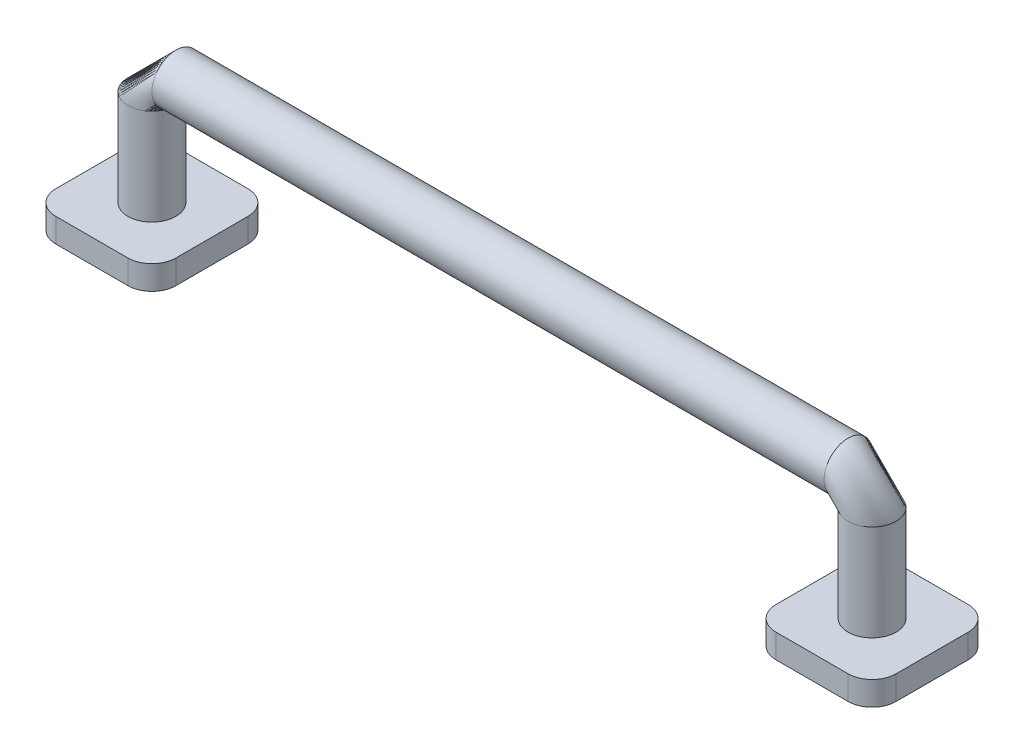
ISO-10303-21;
HEADER;
FILE_DESCRIPTION(('STEP AP214'),'2;1');
FILE_NAME('part.step','',(''),(''),'','','');
FILE_SCHEMA(('AUTOMOTIVE_DESIGN { 1 0 10303 214 1 1 1 1 }'));
ENDSEC;
DATA;
#1=APPLICATION_CONTEXT('core data for automotive mechanical design processes');
#2=APPLICATION_PROTOCOL_DEFINITION('international standard','automotive_design',2000,#1);
#3=PRODUCT_CONTEXT('',#1,'mechanical');
#4=PRODUCT('Part','Part','',(#3));
#5=PRODUCT_RELATED_PRODUCT_CATEGORY('part','',(#4));
#6=PRODUCT_DEFINITION_FORMATION('','',#4);
#7=PRODUCT_DEFINITION_CONTEXT('part definition',#1,'design');
#8=PRODUCT_DEFINITION('design','',#6,#7);
#9=PRODUCT_DEFINITION_SHAPE('','',#8);
#10=(LENGTH_UNIT() NAMED_UNIT(*) SI_UNIT(.MILLI.,.METRE.));
#11=(NAMED_UNIT(*) PLANE_ANGLE_UNIT() SI_UNIT($,.RADIAN.));
#12=(NAMED_UNIT(*) SI_UNIT($,.STERADIAN.) SOLID_ANGLE_UNIT());
#13=UNCERTAINTY_MEASURE_WITH_UNIT(LENGTH_MEASURE(1.E-05),#10,'distance_accuracy_value','');
#14=(GEOMETRIC_REPRESENTATION_CONTEXT(3) GLOBAL_UNCERTAINTY_ASSIGNED_CONTEXT((#13)) GLOBAL_UNIT_ASSIGNED_CONTEXT((#10,
#11,#12)) REPRESENTATION_CONTEXT('',''));
#15=CARTESIAN_POINT('',(0.,0.,0.));
#16=DIRECTION('',(0.,0.,1.));
#17=DIRECTION('',(1.,0.,0.));
#18=AXIS2_PLACEMENT_3D('',#15,#16,#17);
#19=CARTESIAN_POINT('',(1535.3371242892,0.,0.));
#20=DIRECTION('',(0.,1.,0.));
#21=DIRECTION('',(0.,0.,1.));
#22=AXIS2_PLACEMENT_3D('',#19,#20,#21);
#23=CYLINDRICAL_SURFACE('',#22,99.9999999999999);
#24=CARTESIAN_POINT('',(1535.3371242892,400.,0.));
#25=DIRECTION('',(0.,-1.,0.));
#26=DIRECTION('',(1.,0.,0.));
#27=AXIS2_PLACEMENT_3D('',#24,#25,#26);
#28=CIRCLE('',#27,99.9999999999999);
#29=CARTESIAN_POINT('',(1435.3371242892,400.,0.));
#30=VERTEX_POINT('',#29);
#31=EDGE_CURVE('E66',#30,#30,#28,.T.);
#32=ORIENTED_EDGE('',*,*,#31,.T.);
#33=EDGE_LOOP('',(#32));
#34=FACE_BOUND('',#33,.T.);
#35=CARTESIAN_POINT('',(1535.3371242892,0.,0.));
#36=DIRECTION('',(0.,-1.,0.));
#37=DIRECTION('',(1.,0.,0.));
#38=AXIS2_PLACEMENT_3D('',#35,#36,#37);
#39=CIRCLE('',#38,99.9999999999999);
#40=CARTESIAN_POINT('',(1635.3371242892,-1.75298372309235E-13,0.));
#41=VERTEX_POINT('',#40);
#42=EDGE_CURVE('E274',#41,#41,#39,.T.);
#43=ORIENTED_EDGE('',*,*,#42,.F.);
#44=EDGE_LOOP('',(#43));
#45=FACE_BOUND('',#44,.T.);
#46=ADVANCED_FACE('F51',(#34,#45),#23,.T.);
#47=CARTESIAN_POINT('',(1435.3371242892,400.,0.));
#48=DIRECTION('',(0.,0.,1.));
#49=DIRECTION('',(1.,0.,0.));
#50=AXIS2_PLACEMENT_3D('',#47,#48,#49);
#51=TOROIDAL_SURFACE('',#50,100.,99.9999999999999);
#52=CARTESIAN_POINT('',(1435.33712428919,500.,0.));
#53=DIRECTION('',(1.,0.,0.));
#54=DIRECTION('',(0.,1.,0.));
#55=AXIS2_PLACEMENT_3D('',#52,#53,#54);
#56=CIRCLE('',#55,99.9999999999999);
#57=EDGE_CURVE('E278',#30,#30,#56,.T.);
#58=ORIENTED_EDGE('',*,*,#57,.T.);
#59=ORIENTED_EDGE('',*,*,#31,.F.);
#60=EDGE_LOOP('',(#58,#59));
#61=FACE_BOUND('',#60,.T.);
#62=ADVANCED_FACE('F346',(#61),#51,.T.);
#63=CARTESIAN_POINT('',(1435.33712428919,500.,0.));
#64=DIRECTION('',(-1.,0.,0.));
#65=DIRECTION('',(0.,-1.,0.));
#66=AXIS2_PLACEMENT_3D('',#63,#64,#65);
#67=CYLINDRICAL_SURFACE('',#66,99.9999999999999);
#68=CARTESIAN_POINT('',(-1364.6628757108,500.,0.));
#69=DIRECTION('',(1.,0.,0.));
#70=DIRECTION('',(0.,1.,0.));
#71=AXIS2_PLACEMENT_3D('',#68,#69,#70);
#72=CIRCLE('',#71,99.9999999999999);
#73=CARTESIAN_POINT('',(-1364.6628757108,400.,0.));
#74=VERTEX_POINT('',#73);
#75=EDGE_CURVE('E60',#74,#74,#72,.T.);
#76=ORIENTED_EDGE('',*,*,#75,.T.);
#77=EDGE_LOOP('',(#76));
#78=FACE_BOUND('',#77,.T.);
#79=ORIENTED_EDGE('',*,*,#57,.F.);
#80=EDGE_LOOP('',(#79));
#81=FACE_BOUND('',#80,.T.);
#82=ADVANCED_FACE('F281',(#78,#81),#67,.T.);
#83=CARTESIAN_POINT('',(-1364.6628757108,400.,0.));
#84=DIRECTION('',(0.,0.,1.));
#85=DIRECTION('',(1.,0.,0.));
#86=AXIS2_PLACEMENT_3D('',#83,#84,#85);
#87=TOROIDAL_SURFACE('',#86,100.,99.9999999999999);
#88=CARTESIAN_POINT('',(-1464.6628757108,400.00000000001,0.));
#89=DIRECTION('',(0.,1.,0.));
#90=DIRECTION('',(-1.,0.,0.));
#91=AXIS2_PLACEMENT_3D('',#88,#89,#90);
#92=CIRCLE('',#91,99.9999999999999);
#93=EDGE_CURVE('E12',#74,#74,#92,.T.);
#94=ORIENTED_EDGE('',*,*,#93,.T.);
#95=ORIENTED_EDGE('',*,*,#75,.F.);
#96=EDGE_LOOP('',(#94,#95));
#97=FACE_BOUND('',#96,.T.);
#98=ADVANCED_FACE('F284',(#97),#87,.T.);
#99=CARTESIAN_POINT('',(-1464.6628757108,399.999999999999,0.));
#100=DIRECTION('',(0.,-1.,0.));
#101=DIRECTION('',(0.,0.,-1.));
#102=AXIS2_PLACEMENT_3D('',#99,#100,#101);
#103=CYLINDRICAL_SURFACE('',#102,99.9999999999999);
#104=CARTESIAN_POINT('',(-1464.6628757108,0.,0.));
#105=DIRECTION('',(0.,1.,0.));
#106=DIRECTION('',(-1.,0.,0.));
#107=AXIS2_PLACEMENT_3D('',#104,#105,#106);
#108=CIRCLE('',#107,99.9999999999999);
#109=CARTESIAN_POINT('',(-1564.6628757108,1.19787221077977E-13,0.));
#110=VERTEX_POINT('',#109);
#111=EDGE_CURVE('E55',#110,#110,#108,.T.);
#112=ORIENTED_EDGE('',*,*,#111,.T.);
#113=EDGE_LOOP('',(#112));
#114=FACE_BOUND('',#113,.T.);
#115=ORIENTED_EDGE('',*,*,#93,.F.);
#116=EDGE_LOOP('',(#115));
#117=FACE_BOUND('',#116,.T.);
#118=ADVANCED_FACE('F53',(#114,#117),#103,.T.);
#119=CARTESIAN_POINT('',(1685.3371242892,-100.000000000003,-150.));
#120=DIRECTION('',(0.,1.,0.));
#121=DIRECTION('',(-1.,0.,0.));
#122=AXIS2_PLACEMENT_3D('',#119,#120,#121);
#123=CYLINDRICAL_SURFACE('',#122,100.);
#124=CARTESIAN_POINT('',(1685.3371242892,-2.95436854680224E-12,-150.));
#125=DIRECTION('',(0.,-1.,0.));
#126=DIRECTION('',(-1.,0.,0.));
#127=AXIS2_PLACEMENT_3D('',#124,#125,#126);
#128=CIRCLE('',#127,100.);
#129=CARTESIAN_POINT('',(1685.33712428919,-2.95436854680224E-12,-250.));
#130=VERTEX_POINT('',#129);
#131=CARTESIAN_POINT('',(1785.3371242892,-3.12966691911147E-12,-149.999999999999));
#132=VERTEX_POINT('',#131);
#133=EDGE_CURVE('E198',#130,#132,#128,.T.);
#134=ORIENTED_EDGE('',*,*,#133,.T.);
#135=DIRECTION('',(0.,1.,0.));
#136=VECTOR('',#135,1.);
#137=CARTESIAN_POINT('',(1785.3371242892,-100.000000000003,-149.999999999999));
#138=LINE('',#137,#136);
#139=CARTESIAN_POINT('',(1785.3371242892,-100.000000000003,-149.999999999999));
#140=VERTEX_POINT('',#139);
#141=EDGE_CURVE('E271',#140,#132,#138,.T.);
#142=ORIENTED_EDGE('',*,*,#141,.F.);
#143=CARTESIAN_POINT('',(1685.3371242892,-100.000000000003,-150.));
#144=DIRECTION('',(0.,-1.,0.));
#145=DIRECTION('',(-1.,0.,0.));
#146=AXIS2_PLACEMENT_3D('',#143,#144,#145);
#147=CIRCLE('',#146,100.);
#148=CARTESIAN_POINT('',(1685.33712428919,-100.000000000003,-250.));
#149=VERTEX_POINT('',#148);
#150=EDGE_CURVE('E217',#149,#140,#147,.T.);
#151=ORIENTED_EDGE('',*,*,#150,.F.);
#152=DIRECTION('',(0.,1.,0.));
#153=VECTOR('',#152,1.);
#154=CARTESIAN_POINT('',(1685.33712428919,-100.000000000003,-250.));
#155=LINE('',#154,#153);
#156=EDGE_CURVE('E235',#149,#130,#155,.T.);
#157=ORIENTED_EDGE('',*,*,#156,.T.);
#158=EDGE_LOOP('',(#134,#142,#151,#157));
#159=FACE_BOUND('',#158,.T.);
#160=ADVANCED_FACE('F287',(#159),#123,.T.);
#161=CARTESIAN_POINT('',(1785.3371242892,-100.000000000003,149.999999999999));
#162=DIRECTION('',(-1.,0.,0.));
#163=DIRECTION('',(0.,-1.,0.));
#164=AXIS2_PLACEMENT_3D('',#161,#162,#163);
#165=PLANE('',#164);
#166=DIRECTION('',(0.,0.,1.));
#167=VECTOR('',#166,1.);
#168=CARTESIAN_POINT('',(1785.3371242892,-3.12966691911147E-12,149.999999999999));
#169=LINE('',#168,#167);
#170=CARTESIAN_POINT('',(1785.3371242892,-3.12966691911147E-12,149.999999999999));
#171=VERTEX_POINT('',#170);
#172=EDGE_CURVE('E238',#132,#171,#169,.T.);
#173=ORIENTED_EDGE('',*,*,#172,.T.);
#174=DIRECTION('',(0.,1.,0.));
#175=VECTOR('',#174,1.);
#176=CARTESIAN_POINT('',(1785.3371242892,-100.000000000003,149.999999999999));
#177=LINE('',#176,#175);
#178=CARTESIAN_POINT('',(1785.3371242892,-100.000000000003,149.999999999999));
#179=VERTEX_POINT('',#178);
#180=EDGE_CURVE('E268',#179,#171,#177,.T.);
#181=ORIENTED_EDGE('',*,*,#180,.F.);
#182=DIRECTION('',(0.,0.,1.));
#183=VECTOR('',#182,1.);
#184=CARTESIAN_POINT('',(1785.3371242892,-100.000000000003,149.999999999999));
#185=LINE('',#184,#183);
#186=EDGE_CURVE('E220',#140,#179,#185,.T.);
#187=ORIENTED_EDGE('',*,*,#186,.F.);
#188=ORIENTED_EDGE('',*,*,#141,.T.);
#189=EDGE_LOOP('',(#173,#181,#187,#188));
#190=FACE_BOUND('',#189,.T.);
#191=ADVANCED_FACE('F293',(#190),#165,.F.);
#192=CARTESIAN_POINT('',(1685.3371242892,-100.000000000003,150.));
#193=DIRECTION('',(0.,1.,0.));
#194=DIRECTION('',(-1.,0.,0.));
#195=AXIS2_PLACEMENT_3D('',#192,#193,#194);
#196=CYLINDRICAL_SURFACE('',#195,100.);
#197=CARTESIAN_POINT('',(1685.3371242892,-2.95436854680224E-12,150.));
#198=DIRECTION('',(0.,-1.,0.));
#199=DIRECTION('',(-1.,0.,0.));
#200=AXIS2_PLACEMENT_3D('',#197,#198,#199);
#201=CIRCLE('',#200,100.);
#202=CARTESIAN_POINT('',(1685.33712428919,-2.95436854680224E-12,250.));
#203=VERTEX_POINT('',#202);
#204=EDGE_CURVE('E240',#171,#203,#201,.T.);
#205=ORIENTED_EDGE('',*,*,#204,.T.);
#206=DIRECTION('',(0.,1.,0.));
#207=VECTOR('',#206,1.);
#208=CARTESIAN_POINT('',(1685.33712428919,-100.000000000003,250.));
#209=LINE('',#208,#207);
#210=CARTESIAN_POINT('',(1685.33712428919,-100.000000000003,250.));
#211=VERTEX_POINT('',#210);
#212=EDGE_CURVE('E265',#211,#203,#209,.T.);
#213=ORIENTED_EDGE('',*,*,#212,.F.);
#214=CARTESIAN_POINT('',(1685.3371242892,-100.000000000003,150.));
#215=DIRECTION('',(0.,-1.,0.));
#216=DIRECTION('',(-1.,0.,0.));
#217=AXIS2_PLACEMENT_3D('',#214,#215,#216);
#218=CIRCLE('',#217,100.);
#219=EDGE_CURVE('E223',#179,#211,#218,.T.);
#220=ORIENTED_EDGE('',*,*,#219,.F.);
#221=ORIENTED_EDGE('',*,*,#180,.T.);
#222=EDGE_LOOP('',(#205,#213,#220,#221));
#223=FACE_BOUND('',#222,.T.);
#224=ADVANCED_FACE('F336',(#223),#196,.T.);
#225=CARTESIAN_POINT('',(1385.3371242892,-100.000000000002,250.));
#226=DIRECTION('',(0.,0.,-1.));
#227=DIRECTION('',(-1.,0.,0.));
#228=AXIS2_PLACEMENT_3D('',#225,#226,#227);
#229=PLANE('',#228);
#230=DIRECTION('',(-1.,0.,0.));
#231=VECTOR('',#230,1.);
#232=CARTESIAN_POINT('',(1385.3371242892,-2.42847342987453E-12,250.));
#233=LINE('',#232,#231);
#234=CARTESIAN_POINT('',(1385.3371242892,-2.42847342987453E-12,250.));
#235=VERTEX_POINT('',#234);
#236=EDGE_CURVE('E242',#203,#235,#233,.T.);
#237=ORIENTED_EDGE('',*,*,#236,.T.);
#238=DIRECTION('',(0.,1.,0.));
#239=VECTOR('',#238,1.);
#240=CARTESIAN_POINT('',(1385.3371242892,-100.000000000002,250.));
#241=LINE('',#240,#239);
#242=CARTESIAN_POINT('',(1385.3371242892,-100.000000000002,250.));
#243=VERTEX_POINT('',#242);
#244=EDGE_CURVE('E262',#243,#235,#241,.T.);
#245=ORIENTED_EDGE('',*,*,#244,.F.);
#246=DIRECTION('',(-1.,0.,0.));
#247=VECTOR('',#246,1.);
#248=CARTESIAN_POINT('',(1385.3371242892,-100.000000000002,250.));
#249=LINE('',#248,#247);
#250=EDGE_CURVE('E225',#211,#243,#249,.T.);
#251=ORIENTED_EDGE('',*,*,#250,.F.);
#252=ORIENTED_EDGE('',*,*,#212,.T.);
#253=EDGE_LOOP('',(#237,#245,#251,#252));
#254=FACE_BOUND('',#253,.T.);
#255=ADVANCED_FACE('F332',(#254),#229,.F.);
#256=CARTESIAN_POINT('',(1385.3371242892,-100.000000000002,150.));
#257=DIRECTION('',(0.,1.,0.));
#258=DIRECTION('',(-1.,0.,0.));
#259=AXIS2_PLACEMENT_3D('',#256,#257,#258);
#260=CYLINDRICAL_SURFACE('',#259,100.);
#261=CARTESIAN_POINT('',(1385.3371242892,-2.42847342987453E-12,150.));
#262=DIRECTION('',(0.,-1.,0.));
#263=DIRECTION('',(1.,0.,0.));
#264=AXIS2_PLACEMENT_3D('',#261,#262,#263);
#265=CIRCLE('',#264,100.);
#266=CARTESIAN_POINT('',(1285.3371242892,-2.2531750575653E-12,149.999999999999));
#267=VERTEX_POINT('',#266);
#268=EDGE_CURVE('E244',#235,#267,#265,.T.);
#269=ORIENTED_EDGE('',*,*,#268,.T.);
#270=DIRECTION('',(0.,1.,0.));
#271=VECTOR('',#270,1.);
#272=CARTESIAN_POINT('',(1285.3371242892,-100.000000000002,149.999999999999));
#273=LINE('',#272,#271);
#274=CARTESIAN_POINT('',(1285.3371242892,-100.000000000002,149.999999999999));
#275=VERTEX_POINT('',#274);
#276=EDGE_CURVE('E259',#275,#267,#273,.T.);
#277=ORIENTED_EDGE('',*,*,#276,.F.);
#278=CARTESIAN_POINT('',(1385.3371242892,-100.000000000002,150.));
#279=DIRECTION('',(0.,-1.,0.));
#280=DIRECTION('',(1.,0.,0.));
#281=AXIS2_PLACEMENT_3D('',#278,#279,#280);
#282=CIRCLE('',#281,100.);
#283=EDGE_CURVE('E227',#243,#275,#282,.T.);
#284=ORIENTED_EDGE('',*,*,#283,.F.);
#285=ORIENTED_EDGE('',*,*,#244,.T.);
#286=EDGE_LOOP('',(#269,#277,#284,#285));
#287=FACE_BOUND('',#286,.T.);
#288=ADVANCED_FACE('F328',(#287),#260,.T.);
#289=CARTESIAN_POINT('',(1285.3371242892,-100.000000000002,149.999999999999));
#290=DIRECTION('',(1.,0.,0.));
#291=DIRECTION('',(0.,1.,0.));
#292=AXIS2_PLACEMENT_3D('',#289,#290,#291);
#293=PLANE('',#292);
#294=DIRECTION('',(0.,0.,-1.));
#295=VECTOR('',#294,1.);
#296=CARTESIAN_POINT('',(1285.3371242892,-2.25317505756529E-12,149.999999999999));
#297=LINE('',#296,#295);
#298=CARTESIAN_POINT('',(1285.3371242892,-2.25317505756529E-12,-149.999999999999));
#299=VERTEX_POINT('',#298);
#300=EDGE_CURVE('E246',#267,#299,#297,.T.);
#301=ORIENTED_EDGE('',*,*,#300,.T.);
#302=DIRECTION('',(0.,1.,0.));
#303=VECTOR('',#302,1.);
#304=CARTESIAN_POINT('',(1285.3371242892,-100.000000000002,-149.999999999999));
#305=LINE('',#304,#303);
#306=CARTESIAN_POINT('',(1285.3371242892,-100.000000000002,-149.999999999999));
#307=VERTEX_POINT('',#306);
#308=EDGE_CURVE('E256',#307,#299,#305,.T.);
#309=ORIENTED_EDGE('',*,*,#308,.F.);
#310=DIRECTION('',(0.,0.,-1.));
#311=VECTOR('',#310,1.);
#312=CARTESIAN_POINT('',(1285.3371242892,-100.000000000002,149.999999999999));
#313=LINE('',#312,#311);
#314=EDGE_CURVE('E229',#275,#307,#313,.T.);
#315=ORIENTED_EDGE('',*,*,#314,.F.);
#316=ORIENTED_EDGE('',*,*,#276,.T.);
#317=EDGE_LOOP('',(#301,#309,#315,#316));
#318=FACE_BOUND('',#317,.T.);
#319=ADVANCED_FACE('F324',(#318),#293,.F.);
#320=CARTESIAN_POINT('',(1385.3371242892,-100.000000000002,-150.));
#321=DIRECTION('',(0.,1.,0.));
#322=DIRECTION('',(-1.,0.,0.));
#323=AXIS2_PLACEMENT_3D('',#320,#321,#322);
#324=CYLINDRICAL_SURFACE('',#323,100.);
#325=CARTESIAN_POINT('',(1385.3371242892,-2.42847342987453E-12,-150.));
#326=DIRECTION('',(0.,-1.,0.));
#327=DIRECTION('',(-1.,0.,0.));
#328=AXIS2_PLACEMENT_3D('',#325,#326,#327);
#329=CIRCLE('',#328,100.);
#330=CARTESIAN_POINT('',(1385.3371242892,-2.42847342987453E-12,-250.));
#331=VERTEX_POINT('',#330);
#332=EDGE_CURVE('E248',#299,#331,#329,.T.);
#333=ORIENTED_EDGE('',*,*,#332,.T.);
#334=DIRECTION('',(0.,1.,0.));
#335=VECTOR('',#334,1.);
#336=CARTESIAN_POINT('',(1385.3371242892,-100.000000000002,-250.));
#337=LINE('',#336,#335);
#338=CARTESIAN_POINT('',(1385.3371242892,-100.000000000002,-250.));
#339=VERTEX_POINT('',#338);
#340=EDGE_CURVE('E253',#339,#331,#337,.T.);
#341=ORIENTED_EDGE('',*,*,#340,.F.);
#342=CARTESIAN_POINT('',(1385.3371242892,-100.000000000002,-150.));
#343=DIRECTION('',(0.,-1.,0.));
#344=DIRECTION('',(-1.,0.,0.));
#345=AXIS2_PLACEMENT_3D('',#342,#343,#344);
#346=CIRCLE('',#345,100.);
#347=EDGE_CURVE('E231',#307,#339,#346,.T.);
#348=ORIENTED_EDGE('',*,*,#347,.F.);
#349=ORIENTED_EDGE('',*,*,#308,.T.);
#350=EDGE_LOOP('',(#333,#341,#348,#349));
#351=FACE_BOUND('',#350,.T.);
#352=ADVANCED_FACE('F320',(#351),#324,.T.);
#353=CARTESIAN_POINT('',(1385.3371242892,-100.000000000002,-250.));
#354=DIRECTION('',(0.,0.,1.));
#355=DIRECTION('',(1.,0.,0.));
#356=AXIS2_PLACEMENT_3D('',#353,#354,#355);
#357=PLANE('',#356);
#358=DIRECTION('',(1.,0.,0.));
#359=VECTOR('',#358,1.);
#360=CARTESIAN_POINT('',(1385.3371242892,-2.42847342987453E-12,-250.));
#361=LINE('',#360,#359);
#362=EDGE_CURVE('E221',#331,#130,#361,.T.);
#363=ORIENTED_EDGE('',*,*,#362,.T.);
#364=ORIENTED_EDGE('',*,*,#156,.F.);
#365=DIRECTION('',(1.,0.,0.));
#366=VECTOR('',#365,1.);
#367=CARTESIAN_POINT('',(1385.3371242892,-100.000000000002,-250.));
#368=LINE('',#367,#366);
#369=EDGE_CURVE('E233',#339,#149,#368,.T.);
#370=ORIENTED_EDGE('',*,*,#369,.F.);
#371=ORIENTED_EDGE('',*,*,#340,.T.);
#372=EDGE_LOOP('',(#363,#364,#370,#371));
#373=FACE_BOUND('',#372,.T.);
#374=ADVANCED_FACE('F313',(#373),#357,.F.);
#375=CARTESIAN_POINT('',(1685.3371242892,-100.000000000003,-150.));
#376=DIRECTION('',(0.,1.,0.));
#377=DIRECTION('',(-1.,0.,0.));
#378=AXIS2_PLACEMENT_3D('',#375,#376,#377);
#379=PLANE('',#378);
#380=ORIENTED_EDGE('',*,*,#150,.T.);
#381=ORIENTED_EDGE('',*,*,#186,.T.);
#382=ORIENTED_EDGE('',*,*,#219,.T.);
#383=ORIENTED_EDGE('',*,*,#250,.T.);
#384=ORIENTED_EDGE('',*,*,#283,.T.);
#385=ORIENTED_EDGE('',*,*,#314,.T.);
#386=ORIENTED_EDGE('',*,*,#347,.T.);
#387=ORIENTED_EDGE('',*,*,#369,.T.);
#388=EDGE_LOOP('',(#380,#381,#382,#383,#384,#385,#386,#387));
#389=FACE_BOUND('',#388,.T.);
#390=ADVANCED_FACE('F309',(#389),#379,.F.);
#391=CARTESIAN_POINT('',(1685.3371242892,-2.95436854680224E-12,-150.));
#392=DIRECTION('',(0.,1.,0.));
#393=DIRECTION('',(-1.,0.,0.));
#394=AXIS2_PLACEMENT_3D('',#391,#392,#393);
#395=PLANE('',#394);
#396=ORIENTED_EDGE('',*,*,#42,.T.);
#397=EDGE_LOOP('',(#396));
#398=FACE_BOUND('',#397,.T.);
#399=ORIENTED_EDGE('',*,*,#133,.F.);
#400=ORIENTED_EDGE('',*,*,#362,.F.);
#401=ORIENTED_EDGE('',*,*,#332,.F.);
#402=ORIENTED_EDGE('',*,*,#300,.F.);
#403=ORIENTED_EDGE('',*,*,#268,.F.);
#404=ORIENTED_EDGE('',*,*,#236,.F.);
#405=ORIENTED_EDGE('',*,*,#204,.F.);
#406=ORIENTED_EDGE('',*,*,#172,.F.);
#407=EDGE_LOOP('',(#399,#400,#401,#402,#403,#404,#405,#406));
#408=FACE_BOUND('',#407,.T.);
#409=ADVANCED_FACE('F312',(#398,#408),#395,.T.);
#410=CARTESIAN_POINT('',(-1314.66287571081,-99.9999999999977,150.));
#411=DIRECTION('',(0.,1.,0.));
#412=DIRECTION('',(-1.,0.,0.));
#413=AXIS2_PLACEMENT_3D('',#410,#411,#412);
#414=CYLINDRICAL_SURFACE('',#413,100.);
#415=CARTESIAN_POINT('',(-1314.66287571081,2.30458262247483E-12,150.));
#416=DIRECTION('',(0.,-1.,0.));
#417=DIRECTION('',(-1.,0.,0.));
#418=AXIS2_PLACEMENT_3D('',#415,#416,#417);
#419=CIRCLE('',#418,100.);
#420=CARTESIAN_POINT('',(-1214.66287571081,2.12928425016559E-12,149.999999999999));
#421=VERTEX_POINT('',#420);
#422=CARTESIAN_POINT('',(-1314.66287571081,2.30458262247483E-12,250.));
#423=VERTEX_POINT('',#422);
#424=EDGE_CURVE('E188',#421,#423,#419,.T.);
#425=ORIENTED_EDGE('',*,*,#424,.T.);
#426=DIRECTION('',(0.,1.,0.));
#427=VECTOR('',#426,1.);
#428=CARTESIAN_POINT('',(-1314.66287571081,-99.9999999999977,250.));
#429=LINE('',#428,#427);
#430=CARTESIAN_POINT('',(-1314.66287571081,-99.9999999999977,250.));
#431=VERTEX_POINT('',#430);
#432=EDGE_CURVE('E549',#431,#423,#429,.T.);
#433=ORIENTED_EDGE('',*,*,#432,.F.);
#434=CARTESIAN_POINT('',(-1314.66287571081,-99.9999999999977,150.));
#435=DIRECTION('',(0.,-1.,0.));
#436=DIRECTION('',(-1.,0.,0.));
#437=AXIS2_PLACEMENT_3D('',#434,#435,#436);
#438=CIRCLE('',#437,100.);
#439=CARTESIAN_POINT('',(-1214.66287571081,-99.9999999999979,149.999999999999));
#440=VERTEX_POINT('',#439);
#441=EDGE_CURVE('E182',#440,#431,#438,.T.);
#442=ORIENTED_EDGE('',*,*,#441,.F.);
#443=DIRECTION('',(0.,1.,0.));
#444=VECTOR('',#443,1.);
#445=CARTESIAN_POINT('',(-1214.66287571081,-99.9999999999979,149.999999999999));
#446=LINE('',#445,#444);
#447=EDGE_CURVE('E174',#440,#421,#446,.T.);
#448=ORIENTED_EDGE('',*,*,#447,.T.);
#449=EDGE_LOOP('',(#425,#433,#442,#448));
#450=FACE_BOUND('',#449,.T.);
#451=ADVANCED_FACE('F186',(#450),#414,.T.);
#452=CARTESIAN_POINT('',(-1614.6628757108,-99.9999999999972,250.));
#453=DIRECTION('',(0.,0.,-1.));
#454=DIRECTION('',(-1.,0.,0.));
#455=AXIS2_PLACEMENT_3D('',#452,#453,#454);
#456=PLANE('',#455);
#457=DIRECTION('',(-1.,0.,0.));
#458=VECTOR('',#457,1.);
#459=CARTESIAN_POINT('',(-1614.6628757108,2.83047773940253E-12,250.));
#460=LINE('',#459,#458);
#461=CARTESIAN_POINT('',(-1614.6628757108,2.83047773940253E-12,250.));
#462=VERTEX_POINT('',#461);
#463=EDGE_CURVE('E194',#423,#462,#460,.T.);
#464=ORIENTED_EDGE('',*,*,#463,.T.);
#465=DIRECTION('',(0.,1.,0.));
#466=VECTOR('',#465,1.);
#467=CARTESIAN_POINT('',(-1614.6628757108,-99.9999999999972,250.));
#468=LINE('',#467,#466);
#469=CARTESIAN_POINT('',(-1614.6628757108,-99.9999999999972,250.));
#470=VERTEX_POINT('',#469);
#471=EDGE_CURVE('E531',#470,#462,#468,.T.);
#472=ORIENTED_EDGE('',*,*,#471,.F.);
#473=DIRECTION('',(-1.,0.,0.));
#474=VECTOR('',#473,1.);
#475=CARTESIAN_POINT('',(-1614.6628757108,-99.9999999999972,250.));
#476=LINE('',#475,#474);
#477=EDGE_CURVE('E214',#431,#470,#476,.T.);
#478=ORIENTED_EDGE('',*,*,#477,.F.);
#479=ORIENTED_EDGE('',*,*,#432,.T.);
#480=EDGE_LOOP('',(#464,#472,#478,#479));
#481=FACE_BOUND('',#480,.T.);
#482=ADVANCED_FACE('F434',(#481),#456,.F.);
#483=CARTESIAN_POINT('',(-1614.66287571081,-99.9999999999972,150.));
#484=DIRECTION('',(0.,1.,0.));
#485=DIRECTION('',(-1.,0.,0.));
#486=AXIS2_PLACEMENT_3D('',#483,#484,#485);
#487=CYLINDRICAL_SURFACE('',#486,100.);
#488=CARTESIAN_POINT('',(-1614.66287571081,2.83047773940254E-12,150.));
#489=DIRECTION('',(0.,-1.,0.));
#490=DIRECTION('',(1.,0.,0.));
#491=AXIS2_PLACEMENT_3D('',#488,#489,#490);
#492=CIRCLE('',#491,100.);
#493=CARTESIAN_POINT('',(-1714.66287571081,3.00577611171177E-12,149.999999999999));
#494=VERTEX_POINT('',#493);
#495=EDGE_CURVE('E199',#462,#494,#492,.T.);
#496=ORIENTED_EDGE('',*,*,#495,.T.);
#497=DIRECTION('',(0.,1.,0.));
#498=VECTOR('',#497,1.);
#499=CARTESIAN_POINT('',(-1714.66287571081,-99.999999999997,149.999999999999));
#500=LINE('',#499,#498);
#501=CARTESIAN_POINT('',(-1714.66287571081,-99.999999999997,149.999999999999));
#502=VERTEX_POINT('',#501);
#503=EDGE_CURVE('E528',#502,#494,#500,.T.);
#504=ORIENTED_EDGE('',*,*,#503,.F.);
#505=CARTESIAN_POINT('',(-1614.66287571081,-99.9999999999972,150.));
#506=DIRECTION('',(0.,-1.,0.));
#507=DIRECTION('',(1.,0.,0.));
#508=AXIS2_PLACEMENT_3D('',#505,#506,#507);
#509=CIRCLE('',#508,100.);
#510=EDGE_CURVE('E212',#470,#502,#509,.T.);
#511=ORIENTED_EDGE('',*,*,#510,.F.);
#512=ORIENTED_EDGE('',*,*,#471,.T.);
#513=EDGE_LOOP('',(#496,#504,#511,#512));
#514=FACE_BOUND('',#513,.T.);
#515=ADVANCED_FACE('F443',(#514),#487,.T.);
#516=CARTESIAN_POINT('',(-1714.66287571081,-99.999999999997,149.999999999999));
#517=DIRECTION('',(1.,0.,0.));
#518=DIRECTION('',(0.,1.,0.));
#519=AXIS2_PLACEMENT_3D('',#516,#517,#518);
#520=PLANE('',#519);
#521=DIRECTION('',(0.,0.,-1.));
#522=VECTOR('',#521,1.);
#523=CARTESIAN_POINT('',(-1714.66287571081,3.00577611171177E-12,149.999999999999));
#524=LINE('',#523,#522);
#525=CARTESIAN_POINT('',(-1714.66287571081,3.00577611171177E-12,-150.));
#526=VERTEX_POINT('',#525);
#527=EDGE_CURVE('E523',#494,#526,#524,.T.);
#528=ORIENTED_EDGE('',*,*,#527,.T.);
#529=DIRECTION('',(0.,1.,0.));
#530=VECTOR('',#529,1.);
#531=CARTESIAN_POINT('',(-1714.66287571081,-99.999999999997,-150.));
#532=LINE('',#531,#530);
#533=CARTESIAN_POINT('',(-1714.66287571081,-99.999999999997,-150.));
#534=VERTEX_POINT('',#533);
#535=EDGE_CURVE('E535',#534,#526,#532,.T.);
#536=ORIENTED_EDGE('',*,*,#535,.F.);
#537=DIRECTION('',(0.,0.,-1.));
#538=VECTOR('',#537,1.);
#539=CARTESIAN_POINT('',(-1714.66287571081,-99.999999999997,149.999999999999));
#540=LINE('',#539,#538);
#541=EDGE_CURVE('E210',#502,#534,#540,.T.);
#542=ORIENTED_EDGE('',*,*,#541,.F.);
#543=ORIENTED_EDGE('',*,*,#503,.T.);
#544=EDGE_LOOP('',(#528,#536,#542,#543));
#545=FACE_BOUND('',#544,.T.);
#546=ADVANCED_FACE('F453',(#545),#520,.F.);
#547=CARTESIAN_POINT('',(-1614.66287571081,-99.9999999999972,-150.));
#548=DIRECTION('',(0.,1.,0.));
#549=DIRECTION('',(-1.,0.,0.));
#550=AXIS2_PLACEMENT_3D('',#547,#548,#549);
#551=CYLINDRICAL_SURFACE('',#550,100.);
#552=CARTESIAN_POINT('',(-1614.66287571081,2.83047773940254E-12,-150.));
#553=DIRECTION('',(0.,-1.,0.));
#554=DIRECTION('',(1.,0.,0.));
#555=AXIS2_PLACEMENT_3D('',#552,#553,#554);
#556=CIRCLE('',#555,100.);
#557=CARTESIAN_POINT('',(-1614.6628757108,2.83047773940253E-12,-250.));
#558=VERTEX_POINT('',#557);
#559=EDGE_CURVE('E519',#526,#558,#556,.T.);
#560=ORIENTED_EDGE('',*,*,#559,.T.);
#561=DIRECTION('',(0.,1.,0.));
#562=VECTOR('',#561,1.);
#563=CARTESIAN_POINT('',(-1614.6628757108,-99.9999999999972,-250.));
#564=LINE('',#563,#562);
#565=CARTESIAN_POINT('',(-1614.6628757108,-99.9999999999972,-250.));
#566=VERTEX_POINT('',#565);
#567=EDGE_CURVE('E541',#566,#558,#564,.T.);
#568=ORIENTED_EDGE('',*,*,#567,.F.);
#569=CARTESIAN_POINT('',(-1614.66287571081,-99.9999999999972,-150.));
#570=DIRECTION('',(0.,-1.,0.));
#571=DIRECTION('',(1.,0.,0.));
#572=AXIS2_PLACEMENT_3D('',#569,#570,#571);
#573=CIRCLE('',#572,100.);
#574=EDGE_CURVE('E208',#534,#566,#573,.T.);
#575=ORIENTED_EDGE('',*,*,#574,.F.);
#576=ORIENTED_EDGE('',*,*,#535,.T.);
#577=EDGE_LOOP('',(#560,#568,#575,#576));
#578=FACE_BOUND('',#577,.T.);
#579=ADVANCED_FACE('F463',(#578),#551,.T.);
#580=CARTESIAN_POINT('',(-1614.6628757108,-99.9999999999972,-250.));
#581=DIRECTION('',(0.,0.,1.));
#582=DIRECTION('',(1.,0.,0.));
#583=AXIS2_PLACEMENT_3D('',#580,#581,#582);
#584=PLANE('',#583);
#585=DIRECTION('',(1.,0.,0.));
#586=VECTOR('',#585,1.);
#587=CARTESIAN_POINT('',(-1614.6628757108,2.83047773940253E-12,-250.));
#588=LINE('',#587,#586);
#589=CARTESIAN_POINT('',(-1314.66287571081,2.30458262247483E-12,-250.));
#590=VERTEX_POINT('',#589);
#591=EDGE_CURVE('E517',#558,#590,#588,.T.);
#592=ORIENTED_EDGE('',*,*,#591,.T.);
#593=DIRECTION('',(0.,1.,0.));
#594=VECTOR('',#593,1.);
#595=CARTESIAN_POINT('',(-1314.66287571081,-99.9999999999977,-250.));
#596=LINE('',#595,#594);
#597=CARTESIAN_POINT('',(-1314.66287571081,-99.9999999999977,-250.));
#598=VERTEX_POINT('',#597);
#599=EDGE_CURVE('E515',#598,#590,#596,.T.);
#600=ORIENTED_EDGE('',*,*,#599,.F.);
#601=DIRECTION('',(1.,0.,0.));
#602=VECTOR('',#601,1.);
#603=CARTESIAN_POINT('',(-1614.6628757108,-99.9999999999972,-250.));
#604=LINE('',#603,#602);
#605=EDGE_CURVE('E206',#566,#598,#604,.T.);
#606=ORIENTED_EDGE('',*,*,#605,.F.);
#607=ORIENTED_EDGE('',*,*,#567,.T.);
#608=EDGE_LOOP('',(#592,#600,#606,#607));
#609=FACE_BOUND('',#608,.T.);
#610=ADVANCED_FACE('F473',(#609),#584,.F.);
#611=CARTESIAN_POINT('',(-1314.66287571081,-99.9999999999977,-150.));
#612=DIRECTION('',(0.,1.,0.));
#613=DIRECTION('',(-1.,0.,0.));
#614=AXIS2_PLACEMENT_3D('',#611,#612,#613);
#615=CYLINDRICAL_SURFACE('',#614,100.);
#616=CARTESIAN_POINT('',(-1314.66287571081,2.30458262247483E-12,-150.));
#617=DIRECTION('',(0.,-1.,0.));
#618=DIRECTION('',(1.,0.,0.));
#619=AXIS2_PLACEMENT_3D('',#616,#617,#618);
#620=CIRCLE('',#619,100.);
#621=CARTESIAN_POINT('',(-1214.66287571081,2.12928425016559E-12,-150.));
#622=VERTEX_POINT('',#621);
#623=EDGE_CURVE('E181',#590,#622,#620,.T.);
#624=ORIENTED_EDGE('',*,*,#623,.T.);
#625=DIRECTION('',(0.,1.,0.));
#626=VECTOR('',#625,1.);
#627=CARTESIAN_POINT('',(-1214.66287571081,-99.9999999999979,-150.));
#628=LINE('',#627,#626);
#629=CARTESIAN_POINT('',(-1214.66287571081,-99.9999999999979,-150.));
#630=VERTEX_POINT('',#629);
#631=EDGE_CURVE('E177',#630,#622,#628,.T.);
#632=ORIENTED_EDGE('',*,*,#631,.F.);
#633=CARTESIAN_POINT('',(-1314.66287571081,-99.9999999999977,-150.));
#634=DIRECTION('',(0.,-1.,0.));
#635=DIRECTION('',(1.,0.,0.));
#636=AXIS2_PLACEMENT_3D('',#633,#634,#635);
#637=CIRCLE('',#636,100.);
#638=EDGE_CURVE('E204',#598,#630,#637,.T.);
#639=ORIENTED_EDGE('',*,*,#638,.F.);
#640=ORIENTED_EDGE('',*,*,#599,.T.);
#641=EDGE_LOOP('',(#624,#632,#639,#640));
#642=FACE_BOUND('',#641,.T.);
#643=ADVANCED_FACE('F483',(#642),#615,.T.);
#644=CARTESIAN_POINT('',(-1214.66287571081,-99.9999999999979,149.999999999999));
#645=DIRECTION('',(-1.,0.,0.));
#646=DIRECTION('',(0.,-1.,0.));
#647=AXIS2_PLACEMENT_3D('',#644,#645,#646);
#648=PLANE('',#647);
#649=DIRECTION('',(0.,0.,1.));
#650=VECTOR('',#649,1.);
#651=CARTESIAN_POINT('',(-1214.66287571081,2.12928425016559E-12,149.999999999999));
#652=LINE('',#651,#650);
#653=EDGE_CURVE('E170',#622,#421,#652,.T.);
#654=ORIENTED_EDGE('',*,*,#653,.T.);
#655=ORIENTED_EDGE('',*,*,#447,.F.);
#656=DIRECTION('',(0.,0.,1.));
#657=VECTOR('',#656,1.);
#658=CARTESIAN_POINT('',(-1214.66287571081,-99.9999999999979,149.999999999999));
#659=LINE('',#658,#657);
#660=EDGE_CURVE('E190',#630,#440,#659,.T.);
#661=ORIENTED_EDGE('',*,*,#660,.F.);
#662=ORIENTED_EDGE('',*,*,#631,.T.);
#663=EDGE_LOOP('',(#654,#655,#661,#662));
#664=FACE_BOUND('',#663,.T.);
#665=ADVANCED_FACE('F172',(#664),#648,.F.);
#666=CARTESIAN_POINT('',(-1314.66287571081,-99.9999999999977,150.));
#667=DIRECTION('',(0.,1.,0.));
#668=DIRECTION('',(-1.,0.,0.));
#669=AXIS2_PLACEMENT_3D('',#666,#667,#668);
#670=PLANE('',#669);
#671=ORIENTED_EDGE('',*,*,#441,.T.);
#672=ORIENTED_EDGE('',*,*,#477,.T.);
#673=ORIENTED_EDGE('',*,*,#510,.T.);
#674=ORIENTED_EDGE('',*,*,#541,.T.);
#675=ORIENTED_EDGE('',*,*,#574,.T.);
#676=ORIENTED_EDGE('',*,*,#605,.T.);
#677=ORIENTED_EDGE('',*,*,#638,.T.);
#678=ORIENTED_EDGE('',*,*,#660,.T.);
#679=EDGE_LOOP('',(#671,#672,#673,#674,#675,#676,#677,#678));
#680=FACE_BOUND('',#679,.T.);
#681=ADVANCED_FACE('F299',(#680),#670,.F.);
#682=CARTESIAN_POINT('',(-1314.66287571081,2.30458262247483E-12,150.));
#683=DIRECTION('',(0.,1.,0.));
#684=DIRECTION('',(-1.,0.,0.));
#685=AXIS2_PLACEMENT_3D('',#682,#683,#684);
#686=PLANE('',#685);
#687=ORIENTED_EDGE('',*,*,#111,.F.);
#688=EDGE_LOOP('',(#687));
#689=FACE_BOUND('',#688,.T.);
#690=ORIENTED_EDGE('',*,*,#424,.F.);
#691=ORIENTED_EDGE('',*,*,#653,.F.);
#692=ORIENTED_EDGE('',*,*,#623,.F.);
#693=ORIENTED_EDGE('',*,*,#591,.F.);
#694=ORIENTED_EDGE('',*,*,#559,.F.);
#695=ORIENTED_EDGE('',*,*,#527,.F.);
#696=ORIENTED_EDGE('',*,*,#495,.F.);
#697=ORIENTED_EDGE('',*,*,#463,.F.);
#698=EDGE_LOOP('',(#690,#691,#692,#693,#694,#695,#696,#697));
#699=FACE_BOUND('',#698,.T.);
#700=ADVANCED_FACE('F192',(#689,#699),#686,.T.);
#701=CLOSED_SHELL('',(#46,#62,#82,#98,#118,#160,#191,#224,#255,#288,#319,#352,#374,#390,#409,
#451,#482,#515,#546,#579,#610,#643,#665,#681,#700));
#702=MANIFOLD_SOLID_BREP('B2',#701);
#703=ADVANCED_BREP_SHAPE_REPRESENTATION('',(#18,#702),#14);
#704=SHAPE_DEFINITION_REPRESENTATION(#9,#703);
ENDSEC;
END-ISO-10303-21;
